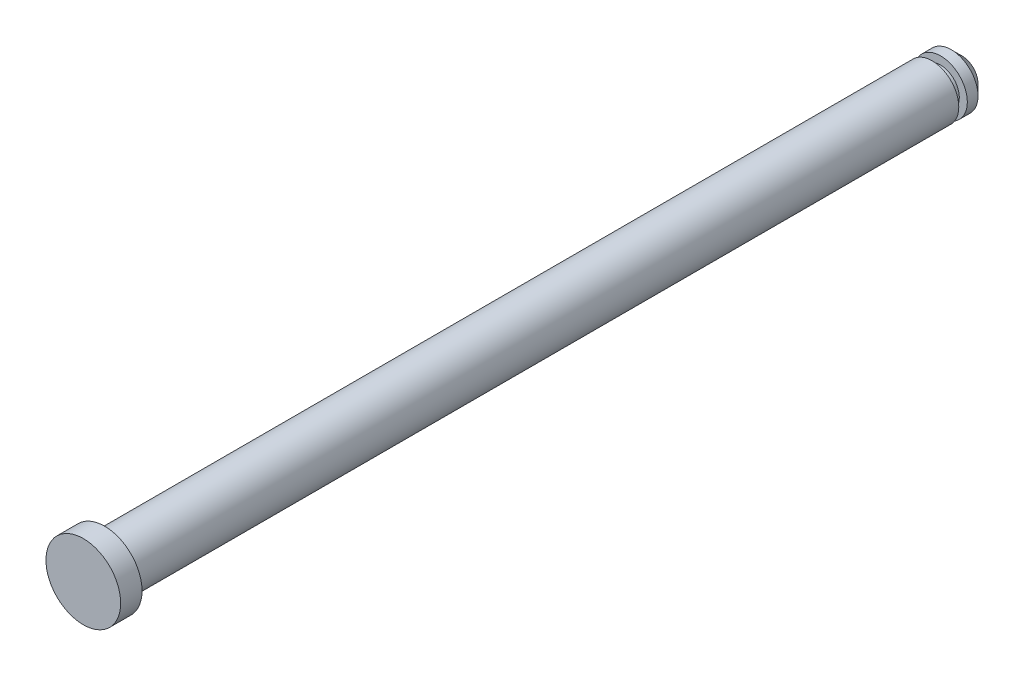
ISO-10303-21;
HEADER;
FILE_DESCRIPTION(('STEP AP214'),'2;1');
FILE_NAME('part.step','',(''),(''),'','','');
FILE_SCHEMA(('AUTOMOTIVE_DESIGN { 1 0 10303 214 1 1 1 1 }'));
ENDSEC;
DATA;
#1=APPLICATION_CONTEXT('core data for automotive mechanical design processes');
#2=APPLICATION_PROTOCOL_DEFINITION('international standard','automotive_design',2000,#1);
#3=PRODUCT_CONTEXT('',#1,'mechanical');
#4=PRODUCT('Part','Part','',(#3));
#5=PRODUCT_RELATED_PRODUCT_CATEGORY('part','',(#4));
#6=PRODUCT_DEFINITION_FORMATION('','',#4);
#7=PRODUCT_DEFINITION_CONTEXT('part definition',#1,'design');
#8=PRODUCT_DEFINITION('design','',#6,#7);
#9=PRODUCT_DEFINITION_SHAPE('','',#8);
#10=(LENGTH_UNIT() NAMED_UNIT(*) SI_UNIT(.MILLI.,.METRE.));
#11=(NAMED_UNIT(*) PLANE_ANGLE_UNIT() SI_UNIT($,.RADIAN.));
#12=(NAMED_UNIT(*) SI_UNIT($,.STERADIAN.) SOLID_ANGLE_UNIT());
#13=UNCERTAINTY_MEASURE_WITH_UNIT(LENGTH_MEASURE(1.E-05),#10,'distance_accuracy_value','');
#14=(GEOMETRIC_REPRESENTATION_CONTEXT(3) GLOBAL_UNCERTAINTY_ASSIGNED_CONTEXT((#13)) GLOBAL_UNIT_ASSIGNED_CONTEXT((#10,
#11,#12)) REPRESENTATION_CONTEXT('',''));
#15=CARTESIAN_POINT('',(0.,0.,0.));
#16=DIRECTION('',(0.,0.,1.));
#17=DIRECTION('',(1.,0.,0.));
#18=AXIS2_PLACEMENT_3D('',#15,#16,#17);
#19=CARTESIAN_POINT('',(0.,0.,0.));
#20=DIRECTION('',(0.,0.,-1.));
#21=DIRECTION('',(-1.,0.,0.));
#22=AXIS2_PLACEMENT_3D('',#19,#20,#21);
#23=PLANE('',#22);
#24=CARTESIAN_POINT('',(0.,0.,0.));
#25=DIRECTION('',(0.,0.,1.));
#26=DIRECTION('',(1.,0.,0.));
#27=AXIS2_PLACEMENT_3D('',#24,#25,#26);
#28=CIRCLE('',#27,3.5);
#29=CARTESIAN_POINT('',(3.5,0.,0.));
#30=VERTEX_POINT('',#29);
#31=EDGE_CURVE('E53',#30,#30,#28,.T.);
#32=ORIENTED_EDGE('',*,*,#31,.T.);
#33=EDGE_LOOP('',(#32));
#34=FACE_BOUND('',#33,.T.);
#35=ADVANCED_FACE('F42',(#34),#23,.F.);
#36=CARTESIAN_POINT('',(0.,0.,0.));
#37=DIRECTION('',(0.,0.,1.));
#38=DIRECTION('',(1.,0.,0.));
#39=AXIS2_PLACEMENT_3D('',#36,#37,#38);
#40=CYLINDRICAL_SURFACE('',#39,3.5);
#41=ORIENTED_EDGE('',*,*,#31,.F.);
#42=EDGE_LOOP('',(#41));
#43=FACE_BOUND('',#42,.T.);
#44=CARTESIAN_POINT('',(0.,0.,-2.));
#45=DIRECTION('',(0.,0.,1.));
#46=DIRECTION('',(1.,0.,0.));
#47=AXIS2_PLACEMENT_3D('',#44,#45,#46);
#48=CIRCLE('',#47,3.5);
#49=CARTESIAN_POINT('',(3.5,0.,-2.));
#50=VERTEX_POINT('',#49);
#51=EDGE_CURVE('E58',#50,#50,#48,.T.);
#52=ORIENTED_EDGE('',*,*,#51,.T.);
#53=EDGE_LOOP('',(#52));
#54=FACE_BOUND('',#53,.T.);
#55=ADVANCED_FACE('F96',(#43,#54),#40,.T.);
#56=CARTESIAN_POINT('',(0.,3.5,-2.));
#57=DIRECTION('',(0.,0.,1.));
#58=DIRECTION('',(1.,0.,0.));
#59=AXIS2_PLACEMENT_3D('',#56,#57,#58);
#60=PLANE('',#59);
#61=ORIENTED_EDGE('',*,*,#51,.F.);
#62=EDGE_LOOP('',(#61));
#63=FACE_BOUND('',#62,.T.);
#64=CARTESIAN_POINT('',(0.,0.,-2.));
#65=DIRECTION('',(0.,0.,1.));
#66=DIRECTION('',(1.,0.,0.));
#67=AXIS2_PLACEMENT_3D('',#64,#65,#66);
#68=CIRCLE('',#67,2.50000000000001);
#69=CARTESIAN_POINT('',(2.50000000000001,0.,-2.));
#70=VERTEX_POINT('',#69);
#71=EDGE_CURVE('E64',#70,#70,#68,.T.);
#72=ORIENTED_EDGE('',*,*,#71,.T.);
#73=EDGE_LOOP('',(#72));
#74=FACE_BOUND('',#73,.T.);
#75=ADVANCED_FACE('F101',(#63,#74),#60,.F.);
#76=CARTESIAN_POINT('',(0.,0.,0.));
#77=DIRECTION('',(0.,0.,1.));
#78=DIRECTION('',(1.,0.,0.));
#79=AXIS2_PLACEMENT_3D('',#76,#77,#78);
#80=CYLINDRICAL_SURFACE('',#79,2.50000000000001);
#81=ORIENTED_EDGE('',*,*,#71,.F.);
#82=EDGE_LOOP('',(#81));
#83=FACE_BOUND('',#82,.T.);
#84=CARTESIAN_POINT('',(0.,0.,-79.5));
#85=DIRECTION('',(0.,0.,1.));
#86=DIRECTION('',(1.,0.,0.));
#87=AXIS2_PLACEMENT_3D('',#84,#85,#86);
#88=CIRCLE('',#87,2.50000000000002);
#89=CARTESIAN_POINT('',(2.50000000000002,0.,-79.5));
#90=VERTEX_POINT('',#89);
#91=EDGE_CURVE('E68',#90,#90,#88,.T.);
#92=ORIENTED_EDGE('',*,*,#91,.T.);
#93=EDGE_LOOP('',(#92));
#94=FACE_BOUND('',#93,.T.);
#95=ADVANCED_FACE('F107',(#83,#94),#80,.T.);
#96=CARTESIAN_POINT('',(0.,2.50000000000002,-79.5));
#97=DIRECTION('',(0.,0.,1.));
#98=DIRECTION('',(1.,0.,0.));
#99=AXIS2_PLACEMENT_3D('',#96,#97,#98);
#100=PLANE('',#99);
#101=ORIENTED_EDGE('',*,*,#91,.F.);
#102=EDGE_LOOP('',(#101));
#103=FACE_BOUND('',#102,.T.);
#104=CARTESIAN_POINT('',(0.,0.,-79.5));
#105=DIRECTION('',(0.,0.,1.));
#106=DIRECTION('',(1.,0.,0.));
#107=AXIS2_PLACEMENT_3D('',#104,#105,#106);
#108=CIRCLE('',#107,1.75000000000002);
#109=CARTESIAN_POINT('',(1.75000000000002,0.,-79.5));
#110=VERTEX_POINT('',#109);
#111=EDGE_CURVE('E71',#110,#110,#108,.T.);
#112=ORIENTED_EDGE('',*,*,#111,.T.);
#113=EDGE_LOOP('',(#112));
#114=FACE_BOUND('',#113,.T.);
#115=ADVANCED_FACE('F111',(#103,#114),#100,.F.);
#116=CARTESIAN_POINT('',(0.,0.,0.));
#117=DIRECTION('',(0.,0.,1.));
#118=DIRECTION('',(1.,0.,0.));
#119=AXIS2_PLACEMENT_3D('',#116,#117,#118);
#120=CYLINDRICAL_SURFACE('',#119,1.75000000000002);
#121=ORIENTED_EDGE('',*,*,#111,.F.);
#122=EDGE_LOOP('',(#121));
#123=FACE_BOUND('',#122,.T.);
#124=CARTESIAN_POINT('',(0.,0.,-80.3));
#125=DIRECTION('',(0.,0.,1.));
#126=DIRECTION('',(1.,0.,0.));
#127=AXIS2_PLACEMENT_3D('',#124,#125,#126);
#128=CIRCLE('',#127,1.75000000000002);
#129=CARTESIAN_POINT('',(1.75000000000002,0.,-80.3));
#130=VERTEX_POINT('',#129);
#131=EDGE_CURVE('E74',#130,#130,#128,.T.);
#132=ORIENTED_EDGE('',*,*,#131,.T.);
#133=EDGE_LOOP('',(#132));
#134=FACE_BOUND('',#133,.T.);
#135=ADVANCED_FACE('F92',(#123,#134),#120,.T.);
#136=CARTESIAN_POINT('',(0.,2.50000000000002,-80.3));
#137=DIRECTION('',(0.,0.,-1.));
#138=DIRECTION('',(-1.,0.,0.));
#139=AXIS2_PLACEMENT_3D('',#136,#137,#138);
#140=PLANE('',#139);
#141=ORIENTED_EDGE('',*,*,#131,.F.);
#142=EDGE_LOOP('',(#141));
#143=FACE_BOUND('',#142,.T.);
#144=CARTESIAN_POINT('',(0.,0.,-80.3));
#145=DIRECTION('',(0.,0.,1.));
#146=DIRECTION('',(1.,0.,0.));
#147=AXIS2_PLACEMENT_3D('',#144,#145,#146);
#148=CIRCLE('',#147,2.50000000000002);
#149=CARTESIAN_POINT('',(2.50000000000002,0.,-80.3));
#150=VERTEX_POINT('',#149);
#151=EDGE_CURVE('E77',#150,#150,#148,.T.);
#152=ORIENTED_EDGE('',*,*,#151,.T.);
#153=EDGE_LOOP('',(#152));
#154=FACE_BOUND('',#153,.T.);
#155=ADVANCED_FACE('F81',(#143,#154),#140,.F.);
#156=CARTESIAN_POINT('',(0.,0.,0.));
#157=DIRECTION('',(0.,0.,1.));
#158=DIRECTION('',(1.,0.,0.));
#159=AXIS2_PLACEMENT_3D('',#156,#157,#158);
#160=CYLINDRICAL_SURFACE('',#159,2.50000000000002);
#161=CARTESIAN_POINT('',(0.,0.,-81.3));
#162=DIRECTION('',(0.,0.,1.));
#163=DIRECTION('',(1.,0.,0.));
#164=AXIS2_PLACEMENT_3D('',#161,#162,#163);
#165=CIRCLE('',#164,2.50000000000002);
#166=CARTESIAN_POINT('',(2.50000000000002,0.,-81.3));
#167=VERTEX_POINT('',#166);
#168=EDGE_CURVE('E49',#167,#167,#165,.T.);
#169=ORIENTED_EDGE('',*,*,#168,.T.);
#170=EDGE_LOOP('',(#169));
#171=FACE_BOUND('',#170,.T.);
#172=ORIENTED_EDGE('',*,*,#151,.F.);
#173=EDGE_LOOP('',(#172));
#174=FACE_BOUND('',#173,.T.);
#175=ADVANCED_FACE('F83',(#171,#174),#160,.T.);
#176=CARTESIAN_POINT('',(0.,0.,-82.3));
#177=DIRECTION('',(0.,0.,1.));
#178=DIRECTION('',(1.,0.,0.));
#179=AXIS2_PLACEMENT_3D('',#176,#177,#178);
#180=PLANE('',#179);
#181=CARTESIAN_POINT('',(0.,0.,-82.3));
#182=DIRECTION('',(0.,0.,1.));
#183=DIRECTION('',(1.,0.,0.));
#184=AXIS2_PLACEMENT_3D('',#181,#182,#183);
#185=CIRCLE('',#184,1.5);
#186=CARTESIAN_POINT('',(1.5,0.,-82.3));
#187=VERTEX_POINT('',#186);
#188=EDGE_CURVE('E12',#187,#187,#185,.F.);
#189=ORIENTED_EDGE('',*,*,#188,.T.);
#190=EDGE_LOOP('',(#189));
#191=FACE_BOUND('',#190,.T.);
#192=ADVANCED_FACE('F85',(#191),#180,.F.);
#193=CARTESIAN_POINT('',(0.,0.,-81.3));
#194=DIRECTION('',(0.,0.,1.));
#195=DIRECTION('',(1.,0.,0.));
#196=AXIS2_PLACEMENT_3D('',#193,#194,#195);
#197=CONICAL_SURFACE('',#196,2.50000000000002,0.78539816339745);
#198=ORIENTED_EDGE('',*,*,#188,.F.);
#199=EDGE_LOOP('',(#198));
#200=FACE_BOUND('',#199,.T.);
#201=ORIENTED_EDGE('',*,*,#168,.F.);
#202=EDGE_LOOP('',(#201));
#203=FACE_BOUND('',#202,.T.);
#204=ADVANCED_FACE('F44',(#200,#203),#197,.T.);
#205=CLOSED_SHELL('',(#35,#55,#75,#95,#115,#135,#155,#175,#192,#204));
#206=MANIFOLD_SOLID_BREP('B2',#205);
#207=ADVANCED_BREP_SHAPE_REPRESENTATION('',(#18,#206),#14);
#208=SHAPE_DEFINITION_REPRESENTATION(#9,#207);
ENDSEC;
END-ISO-10303-21;
